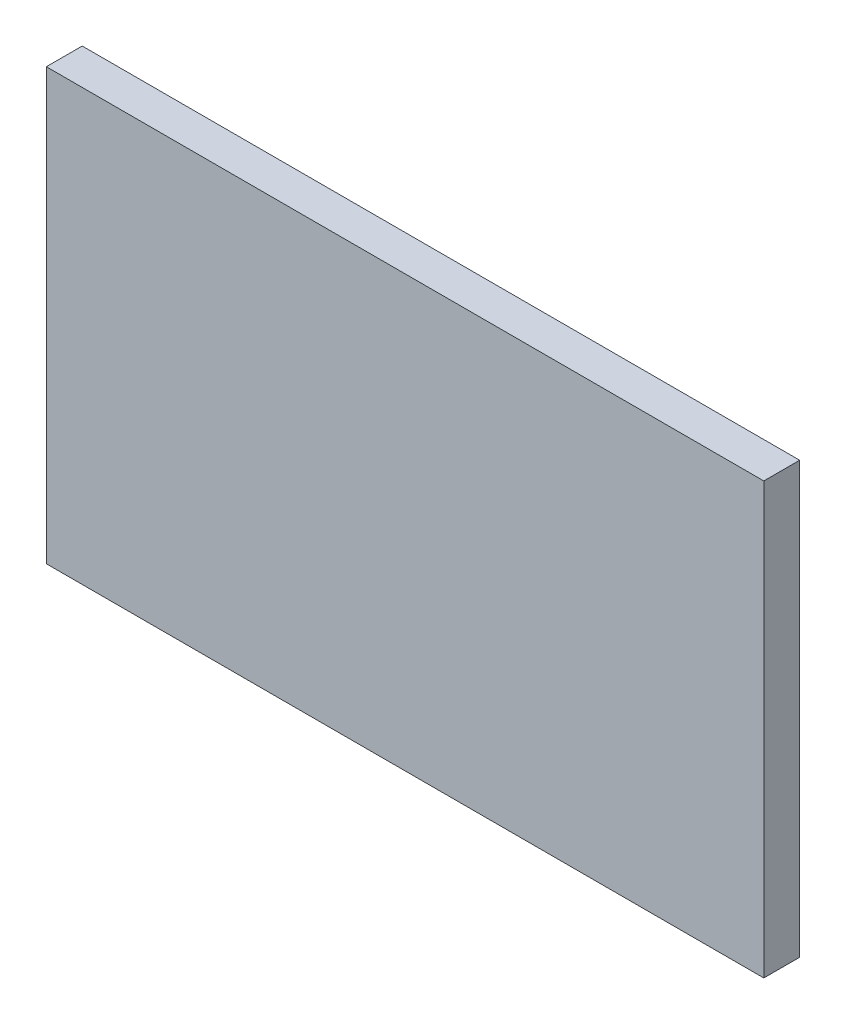
ISO-10303-21;
HEADER;
FILE_DESCRIPTION(('STEP AP214'),'2;1');
FILE_NAME('part.step','',(''),(''),'','','');
FILE_SCHEMA(('AUTOMOTIVE_DESIGN { 1 0 10303 214 1 1 1 1 }'));
ENDSEC;
DATA;
#1=APPLICATION_CONTEXT('core data for automotive mechanical design processes');
#2=APPLICATION_PROTOCOL_DEFINITION('international standard','automotive_design',2000,#1);
#3=PRODUCT_CONTEXT('',#1,'mechanical');
#4=PRODUCT('Part','Part','',(#3));
#5=PRODUCT_RELATED_PRODUCT_CATEGORY('part','',(#4));
#6=PRODUCT_DEFINITION_FORMATION('','',#4);
#7=PRODUCT_DEFINITION_CONTEXT('part definition',#1,'design');
#8=PRODUCT_DEFINITION('design','',#6,#7);
#9=PRODUCT_DEFINITION_SHAPE('','',#8);
#10=(LENGTH_UNIT() NAMED_UNIT(*) SI_UNIT(.MILLI.,.METRE.));
#11=(NAMED_UNIT(*) PLANE_ANGLE_UNIT() SI_UNIT($,.RADIAN.));
#12=(NAMED_UNIT(*) SI_UNIT($,.STERADIAN.) SOLID_ANGLE_UNIT());
#13=UNCERTAINTY_MEASURE_WITH_UNIT(LENGTH_MEASURE(1.E-05),#10,'distance_accuracy_value','');
#14=(GEOMETRIC_REPRESENTATION_CONTEXT(3) GLOBAL_UNCERTAINTY_ASSIGNED_CONTEXT((#13)) GLOBAL_UNIT_ASSIGNED_CONTEXT((#10,
#11,#12)) REPRESENTATION_CONTEXT('',''));
#15=CARTESIAN_POINT('',(0.,0.,0.));
#16=DIRECTION('',(0.,0.,1.));
#17=DIRECTION('',(1.,0.,0.));
#18=AXIS2_PLACEMENT_3D('',#15,#16,#17);
#19=CARTESIAN_POINT('',(-100.,-60.,10.));
#20=DIRECTION('',(1.,0.,0.));
#21=DIRECTION('',(0.,0.,-1.));
#22=AXIS2_PLACEMENT_3D('',#19,#20,#21);
#23=PLANE('',#22);
#24=DIRECTION('',(0.,-1.,0.));
#25=VECTOR('',#24,1.);
#26=CARTESIAN_POINT('',(-100.,-60.,0.));
#27=LINE('',#26,#25);
#28=CARTESIAN_POINT('',(-100.,60.,0.));
#29=VERTEX_POINT('',#28);
#30=CARTESIAN_POINT('',(-100.,-60.,0.));
#31=VERTEX_POINT('',#30);
#32=EDGE_CURVE('E101',#29,#31,#27,.T.);
#33=ORIENTED_EDGE('',*,*,#32,.T.);
#34=DIRECTION('',(0.,0.,-1.));
#35=VECTOR('',#34,1.);
#36=CARTESIAN_POINT('',(-100.,-60.,10.));
#37=LINE('',#36,#35);
#38=CARTESIAN_POINT('',(-100.,-60.,10.));
#39=VERTEX_POINT('',#38);
#40=EDGE_CURVE('E11',#39,#31,#37,.T.);
#41=ORIENTED_EDGE('',*,*,#40,.F.);
#42=DIRECTION('',(0.,-1.,0.));
#43=VECTOR('',#42,1.);
#44=CARTESIAN_POINT('',(-100.,-60.,10.));
#45=LINE('',#44,#43);
#46=CARTESIAN_POINT('',(-100.,60.,10.));
#47=VERTEX_POINT('',#46);
#48=EDGE_CURVE('E89',#47,#39,#45,.T.);
#49=ORIENTED_EDGE('',*,*,#48,.F.);
#50=DIRECTION('',(0.,0.,-1.));
#51=VECTOR('',#50,1.);
#52=CARTESIAN_POINT('',(-100.,60.,10.));
#53=LINE('',#52,#51);
#54=EDGE_CURVE('E97',#47,#29,#53,.T.);
#55=ORIENTED_EDGE('',*,*,#54,.T.);
#56=EDGE_LOOP('',(#33,#41,#49,#55));
#57=FACE_BOUND('',#56,.T.);
#58=ADVANCED_FACE('F38',(#57),#23,.F.);
#59=CARTESIAN_POINT('',(-100.,-60.,10.));
#60=DIRECTION('',(0.,1.,0.));
#61=DIRECTION('',(0.,0.,1.));
#62=AXIS2_PLACEMENT_3D('',#59,#60,#61);
#63=PLANE('',#62);
#64=DIRECTION('',(1.,0.,0.));
#65=VECTOR('',#64,1.);
#66=CARTESIAN_POINT('',(-100.,-60.,0.));
#67=LINE('',#66,#65);
#68=CARTESIAN_POINT('',(100.,-60.,0.));
#69=VERTEX_POINT('',#68);
#70=EDGE_CURVE('E93',#31,#69,#67,.T.);
#71=ORIENTED_EDGE('',*,*,#70,.T.);
#72=DIRECTION('',(0.,0.,-1.));
#73=VECTOR('',#72,1.);
#74=CARTESIAN_POINT('',(100.,-60.,10.));
#75=LINE('',#74,#73);
#76=CARTESIAN_POINT('',(100.,-60.,10.));
#77=VERTEX_POINT('',#76);
#78=EDGE_CURVE('E46',#77,#69,#75,.T.);
#79=ORIENTED_EDGE('',*,*,#78,.F.);
#80=DIRECTION('',(1.,0.,0.));
#81=VECTOR('',#80,1.);
#82=CARTESIAN_POINT('',(-100.,-60.,10.));
#83=LINE('',#82,#81);
#84=EDGE_CURVE('E84',#39,#77,#83,.T.);
#85=ORIENTED_EDGE('',*,*,#84,.F.);
#86=ORIENTED_EDGE('',*,*,#40,.T.);
#87=EDGE_LOOP('',(#71,#79,#85,#86));
#88=FACE_BOUND('',#87,.T.);
#89=ADVANCED_FACE('F92',(#88),#63,.F.);
#90=CARTESIAN_POINT('',(100.,-60.,10.));
#91=DIRECTION('',(-1.,0.,0.));
#92=DIRECTION('',(0.,0.,1.));
#93=AXIS2_PLACEMENT_3D('',#90,#91,#92);
#94=PLANE('',#93);
#95=DIRECTION('',(0.,1.,0.));
#96=VECTOR('',#95,1.);
#97=CARTESIAN_POINT('',(100.,-60.,0.));
#98=LINE('',#97,#96);
#99=CARTESIAN_POINT('',(100.,60.,0.));
#100=VERTEX_POINT('',#99);
#101=EDGE_CURVE('E71',#69,#100,#98,.T.);
#102=ORIENTED_EDGE('',*,*,#101,.T.);
#103=DIRECTION('',(0.,0.,-1.));
#104=VECTOR('',#103,1.);
#105=CARTESIAN_POINT('',(100.,60.,10.));
#106=LINE('',#105,#104);
#107=CARTESIAN_POINT('',(100.,60.,10.));
#108=VERTEX_POINT('',#107);
#109=EDGE_CURVE('E94',#108,#100,#106,.T.);
#110=ORIENTED_EDGE('',*,*,#109,.F.);
#111=DIRECTION('',(0.,1.,0.));
#112=VECTOR('',#111,1.);
#113=CARTESIAN_POINT('',(100.,-60.,10.));
#114=LINE('',#113,#112);
#115=EDGE_CURVE('E87',#77,#108,#114,.T.);
#116=ORIENTED_EDGE('',*,*,#115,.F.);
#117=ORIENTED_EDGE('',*,*,#78,.T.);
#118=EDGE_LOOP('',(#102,#110,#116,#117));
#119=FACE_BOUND('',#118,.T.);
#120=ADVANCED_FACE('F95',(#119),#94,.F.);
#121=CARTESIAN_POINT('',(-100.,60.,10.));
#122=DIRECTION('',(0.,-1.,0.));
#123=DIRECTION('',(0.,0.,-1.));
#124=AXIS2_PLACEMENT_3D('',#121,#122,#123);
#125=PLANE('',#124);
#126=DIRECTION('',(-1.,0.,0.));
#127=VECTOR('',#126,1.);
#128=CARTESIAN_POINT('',(-100.,60.,0.));
#129=LINE('',#128,#127);
#130=EDGE_CURVE('E77',#100,#29,#129,.T.);
#131=ORIENTED_EDGE('',*,*,#130,.T.);
#132=ORIENTED_EDGE('',*,*,#54,.F.);
#133=DIRECTION('',(-1.,0.,0.));
#134=VECTOR('',#133,1.);
#135=CARTESIAN_POINT('',(-100.,60.,10.));
#136=LINE('',#135,#134);
#137=EDGE_CURVE('E54',#108,#47,#136,.T.);
#138=ORIENTED_EDGE('',*,*,#137,.F.);
#139=ORIENTED_EDGE('',*,*,#109,.T.);
#140=EDGE_LOOP('',(#131,#132,#138,#139));
#141=FACE_BOUND('',#140,.T.);
#142=ADVANCED_FACE('F108',(#141),#125,.F.);
#143=CARTESIAN_POINT('',(0.,0.,10.));
#144=DIRECTION('',(0.,0.,-1.));
#145=DIRECTION('',(-1.,0.,0.));
#146=AXIS2_PLACEMENT_3D('',#143,#144,#145);
#147=PLANE('',#146);
#148=ORIENTED_EDGE('',*,*,#48,.T.);
#149=ORIENTED_EDGE('',*,*,#84,.T.);
#150=ORIENTED_EDGE('',*,*,#115,.T.);
#151=ORIENTED_EDGE('',*,*,#137,.T.);
#152=EDGE_LOOP('',(#148,#149,#150,#151));
#153=FACE_BOUND('',#152,.T.);
#154=ADVANCED_FACE('F85',(#153),#147,.F.);
#155=CARTESIAN_POINT('',(0.,0.,0.));
#156=DIRECTION('',(0.,0.,-1.));
#157=DIRECTION('',(-1.,0.,0.));
#158=AXIS2_PLACEMENT_3D('',#155,#156,#157);
#159=PLANE('',#158);
#160=ORIENTED_EDGE('',*,*,#32,.F.);
#161=ORIENTED_EDGE('',*,*,#130,.F.);
#162=ORIENTED_EDGE('',*,*,#101,.F.);
#163=ORIENTED_EDGE('',*,*,#70,.F.);
#164=EDGE_LOOP('',(#160,#161,#162,#163));
#165=FACE_BOUND('',#164,.T.);
#166=ADVANCED_FACE('F111',(#165),#159,.T.);
#167=CLOSED_SHELL('',(#58,#89,#120,#142,#154,#166));
#168=MANIFOLD_SOLID_BREP('B2',#167);
#169=ADVANCED_BREP_SHAPE_REPRESENTATION('',(#18,#168),#14);
#170=SHAPE_DEFINITION_REPRESENTATION(#9,#169);
ENDSEC;
END-ISO-10303-21;
